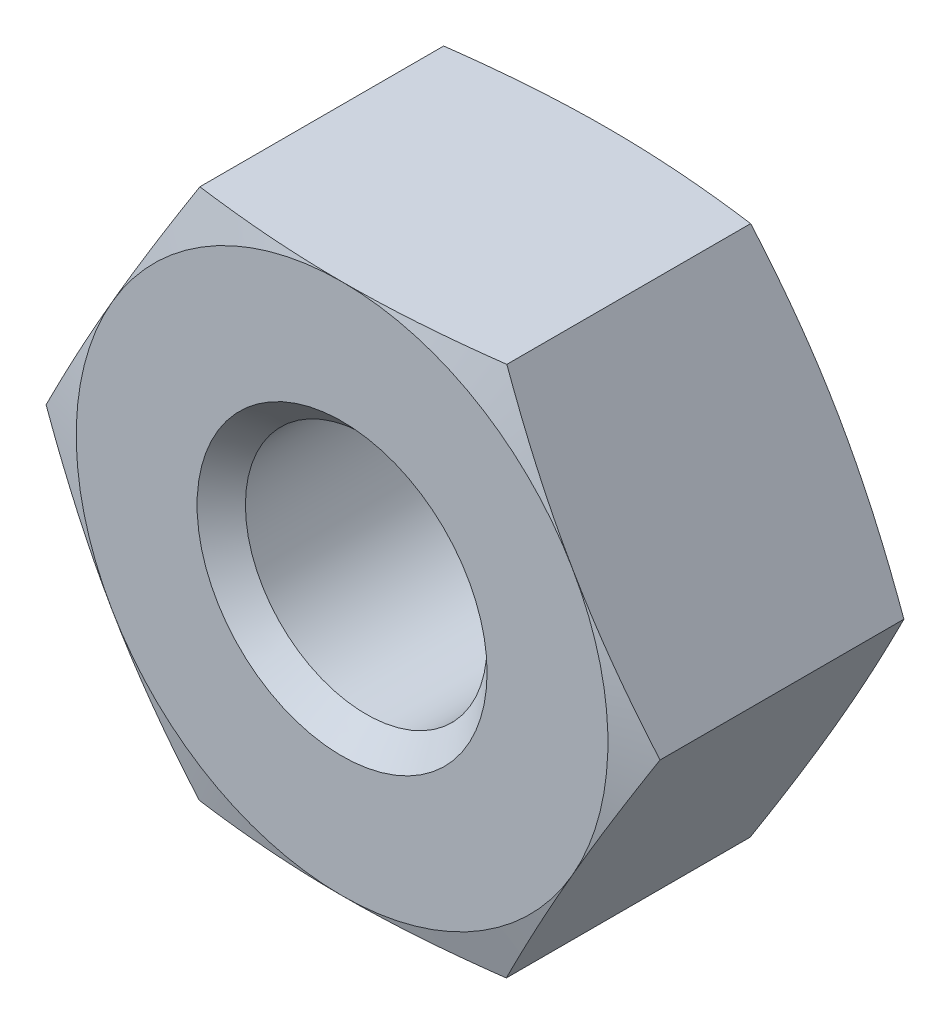
ISO-10303-21;
HEADER;
FILE_DESCRIPTION(('STEP AP214'),'2;1');
FILE_NAME('part.step','',(''),(''),'','','');
FILE_SCHEMA(('AUTOMOTIVE_DESIGN { 1 0 10303 214 1 1 1 1 }'));
ENDSEC;
DATA;
#1=APPLICATION_CONTEXT('core data for automotive mechanical design processes');
#2=APPLICATION_PROTOCOL_DEFINITION('international standard','automotive_design',2000,#1);
#3=PRODUCT_CONTEXT('',#1,'mechanical');
#4=PRODUCT('Part','Part','',(#3));
#5=PRODUCT_RELATED_PRODUCT_CATEGORY('part','',(#4));
#6=PRODUCT_DEFINITION_FORMATION('','',#4);
#7=PRODUCT_DEFINITION_CONTEXT('part definition',#1,'design');
#8=PRODUCT_DEFINITION('design','',#6,#7);
#9=PRODUCT_DEFINITION_SHAPE('','',#8);
#10=(LENGTH_UNIT() NAMED_UNIT(*) SI_UNIT(.MILLI.,.METRE.));
#11=(NAMED_UNIT(*) PLANE_ANGLE_UNIT() SI_UNIT($,.RADIAN.));
#12=(NAMED_UNIT(*) SI_UNIT($,.STERADIAN.) SOLID_ANGLE_UNIT());
#13=UNCERTAINTY_MEASURE_WITH_UNIT(LENGTH_MEASURE(1.E-05),#10,'distance_accuracy_value','');
#14=(GEOMETRIC_REPRESENTATION_CONTEXT(3) GLOBAL_UNCERTAINTY_ASSIGNED_CONTEXT((#13)) GLOBAL_UNIT_ASSIGNED_CONTEXT((#10,
#11,#12)) REPRESENTATION_CONTEXT('',''));
#15=CARTESIAN_POINT('',(0.,0.,0.));
#16=DIRECTION('',(0.,0.,1.));
#17=DIRECTION('',(1.,0.,0.));
#18=AXIS2_PLACEMENT_3D('',#15,#16,#17);
#19=CARTESIAN_POINT('',(6.35084977552726,-0.00636097623993477,5.50000000000001));
#20=DIRECTION('',(-0.866525766391595,-0.499132343351401,0.));
#21=DIRECTION('',(0.499132343351401,-0.866525766391595,0.));
#22=AXIS2_PLACEMENT_3D('',#19,#20,#21);
#23=PLANE('',#22);
#24=CARTESIAN_POINT('',(3.18081845166395,5.49701675310534,0.22801628688518));
#25=CARTESIAN_POINT('',(3.31246664803024,5.26846703924707,0.192664644462758));
#26=CARTESIAN_POINT('',(3.44435354163455,5.03950293167164,0.160571156165237));
#27=CARTESIAN_POINT('',(3.70859310915607,4.58076609201874,0.10418586946862));
#28=CARTESIAN_POINT('',(3.84094595027029,4.35099306967653,0.079897240134499));
#29=CARTESIAN_POINT('',(4.10531493618668,3.89203155138821,0.0405396576158701));
#30=CARTESIAN_POINT('',(4.23732929322934,3.66284615910729,0.0254237676799952));
#31=CARTESIAN_POINT('',(4.50152636358558,3.20418309725941,0.00515490271981662));
#32=CARTESIAN_POINT('',(4.63370903936968,2.97470549284606,0.));
#33=CARTESIAN_POINT('',(4.89807439093786,2.51575028401935,0.));
#34=CARTESIAN_POINT('',(5.03025706672196,2.28627267960599,0.00515490271981696));
#35=CARTESIAN_POINT('',(5.29445413707821,1.82760961775811,0.0254237676799957));
#36=CARTESIAN_POINT('',(5.42646849412087,1.59842422547719,0.0405396576158706));
#37=CARTESIAN_POINT('',(5.69083748003725,1.13946270718887,0.0798972401344997));
#38=CARTESIAN_POINT('',(5.82319032115147,0.909689684846668,0.104185869468621));
#39=CARTESIAN_POINT('',(6.08742988867299,0.450952845193763,0.160571156165238));
#40=CARTESIAN_POINT('',(6.21931678227731,0.221988737618332,0.192664644462759));
#41=CARTESIAN_POINT('',(6.35096497864359,-0.00656097623993358,0.22801628688518));
#42=B_SPLINE_CURVE_WITH_KNOTS('',3,(#24,#25,#26,#27,#28,#29,#30,#31,#32,#33,#34,#35,#36,#37,#38,
#39,#40,#41),.UNSPECIFIED.,.F.,.F.,(4,2,2,2,2,2,2,2,4),(0.,0.798379868632193,1.59708350096319,
2.39166493900168,3.18609259062311,3.98052024224453,4.77510168028303,5.57380531261402,
6.37218518124621),.UNSPECIFIED.);
#43=CARTESIAN_POINT('',(3.18093365478028,5.49681675310534,0.227985363800587));
#44=VERTEX_POINT('',#43);
#45=CARTESIAN_POINT('',(4.76589171515377,2.7452278884327,0.));
#46=VERTEX_POINT('',#45);
#47=EDGE_CURVE('E141',#44,#46,#42,.T.);
#48=ORIENTED_EDGE('',*,*,#47,.F.);
#49=DIRECTION('',(0.,0.,-1.));
#50=VECTOR('',#49,1.);
#51=CARTESIAN_POINT('',(3.18093365478028,5.49681675310534,5.50000000000001));
#52=LINE('',#51,#50);
#53=CARTESIAN_POINT('',(3.18093365478028,5.49681675310534,5.2720146361994));
#54=VERTEX_POINT('',#53);
#55=EDGE_CURVE('E356',#54,#44,#52,.T.);
#56=ORIENTED_EDGE('',*,*,#55,.F.);
#57=CARTESIAN_POINT('',(6.35096497864359,-0.00656097623993358,5.27198371311481));
#58=CARTESIAN_POINT('',(6.21931678227731,0.221988737618331,5.30733535553724));
#59=CARTESIAN_POINT('',(6.08742988867299,0.450952845193761,5.33942884383477));
#60=CARTESIAN_POINT('',(5.82319032115147,0.909689684846667,5.39581413053139));
#61=CARTESIAN_POINT('',(5.69083748003725,1.13946270718887,5.42010275986551));
#62=CARTESIAN_POINT('',(5.42646849412086,1.59842422547719,5.45946034238413));
#63=CARTESIAN_POINT('',(5.29445413707821,1.82760961775811,5.47457623232001));
#64=CARTESIAN_POINT('',(5.03025706672196,2.28627267960599,5.49484509728019));
#65=CARTESIAN_POINT('',(4.89807439093786,2.51575028401935,5.5));
#66=CARTESIAN_POINT('',(4.63370903936968,2.97470549284606,5.5));
#67=CARTESIAN_POINT('',(4.50152636358558,3.20418309725941,5.49484509728019));
#68=CARTESIAN_POINT('',(4.23732929322934,3.66284615910729,5.47457623232001));
#69=CARTESIAN_POINT('',(4.10531493618668,3.89203155138821,5.45946034238413));
#70=CARTESIAN_POINT('',(3.84094595027029,4.35099306967653,5.42010275986551));
#71=CARTESIAN_POINT('',(3.70859310915607,4.58076609201874,5.39581413053139));
#72=CARTESIAN_POINT('',(3.44435354163455,5.03950293167164,5.33942884383477));
#73=CARTESIAN_POINT('',(3.31246664803024,5.26846703924707,5.30733535553724));
#74=CARTESIAN_POINT('',(3.18081845166395,5.49701675310534,5.27198371311481));
#75=B_SPLINE_CURVE_WITH_KNOTS('',3,(#57,#58,#59,#60,#61,#62,#63,#64,#65,#66,#67,#68,#69,#70,#71,
#72,#73,#74),.UNSPECIFIED.,.F.,.F.,(4,2,2,2,2,2,2,2,4),(0.,0.798379868632195,1.59708350096319,
2.39166493900169,3.18609259062311,3.98052024224453,4.77510168028303,5.57380531261402,
6.37218518124622),.UNSPECIFIED.);
#76=CARTESIAN_POINT('',(4.76589171515377,2.7452278884327,5.50000000000001));
#77=VERTEX_POINT('',#76);
#78=EDGE_CURVE('E323',#77,#54,#75,.T.);
#79=ORIENTED_EDGE('',*,*,#78,.F.);
#80=CARTESIAN_POINT('',(6.35084977552726,-0.00636097623993304,5.2720146361994));
#81=VERTEX_POINT('',#80);
#82=EDGE_CURVE('E502',#81,#77,#75,.T.);
#83=ORIENTED_EDGE('',*,*,#82,.F.);
#84=DIRECTION('',(0.,0.,-1.));
#85=VECTOR('',#84,1.);
#86=CARTESIAN_POINT('',(6.35084977552726,-0.00636097623993477,5.50000000000001));
#87=LINE('',#86,#85);
#88=CARTESIAN_POINT('',(6.35084977552726,-0.00636097623993477,0.227985363800587));
#89=VERTEX_POINT('',#88);
#90=EDGE_CURVE('E175',#81,#89,#87,.T.);
#91=ORIENTED_EDGE('',*,*,#90,.T.);
#92=EDGE_CURVE('E154',#46,#89,#42,.T.);
#93=ORIENTED_EDGE('',*,*,#92,.F.);
#94=EDGE_LOOP('',(#48,#56,#79,#83,#91,#93));
#95=FACE_BOUND('',#94,.T.);
#96=ADVANCED_FACE('F52',(#95),#23,.F.);
#97=CARTESIAN_POINT('',(3.18093365478028,5.49681675310534,5.50000000000001));
#98=DIRECTION('',(-0.00100159400302746,-0.999999498404602,0.));
#99=DIRECTION('',(0.999999498404602,-0.00100159400302746,0.));
#100=AXIS2_PLACEMENT_3D('',#97,#98,#99);
#101=PLANE('',#100);
#102=CARTESIAN_POINT('',(-3.17011612074698,5.50317792966417,0.228012159366131));
#103=CARTESIAN_POINT('',(-2.9063647120604,5.50291375770243,0.192661114730014));
#104=CARTESIAN_POINT('',(-2.64213508884684,5.50264910676365,0.160568187694157));
#105=CARTESIAN_POINT('',(-2.11274268631971,5.50211887024207,0.10418390955789));
#106=CARTESIAN_POINT('',(-1.84757957204988,5.50185328432378,0.0798957273696159));
#107=CARTESIAN_POINT('',(-1.31792788831693,5.50132278810756,0.0405388790591946));
#108=CARTESIAN_POINT('',(-1.05344290043137,5.50105788139693,0.0254232777808005));
#109=CARTESIAN_POINT('',(-0.524135635901857,5.5005277301491,0.00515480204786059));
#110=CARTESIAN_POINT('',(-0.259313434442604,5.5002624856872,0.));
#111=CARTESIAN_POINT('',(0.270330968475903,5.49973199676341,0.));
#112=CARTESIAN_POINT('',(0.535153169935157,5.49946675230151,0.00515480204786038));
#113=CARTESIAN_POINT('',(1.06446043446467,5.49893660105368,0.0254232777808003));
#114=CARTESIAN_POINT('',(1.32894542235023,5.49867169434305,0.0405388790591946));
#115=CARTESIAN_POINT('',(1.85859710608318,5.49814119812683,0.079895727369616));
#116=CARTESIAN_POINT('',(2.12376022035301,5.49787561220854,0.10418390955789));
#117=CARTESIAN_POINT('',(2.65315262288014,5.49734537568695,0.160568187694156));
#118=CARTESIAN_POINT('',(2.9173822460937,5.49708072474817,0.192661114730013));
#119=CARTESIAN_POINT('',(3.18113365478028,5.49681655278644,0.228012159366131));
#120=B_SPLINE_CURVE_WITH_KNOTS('',3,(#102,#103,#104,#105,#106,#107,#108,#109,#110,#111,#112,
#113,#114,#115,#116,#117,#118,#119),.UNSPECIFIED.,.F.,.F.,(4,2,2,2,2,2,2,2,4),(0.,
0.798372052941037,1.59706785554565,2.39164157380206,3.18606151238685,3.98048145097164,
4.77505516922805,5.57375097183266,6.3721230247737),.UNSPECIFIED.);
#121=CARTESIAN_POINT('',(-3.16991612074698,5.50317772934527,0.227985363800587));
#122=VERTEX_POINT('',#121);
#123=CARTESIAN_POINT('',(0.00550876701665114,5.4999972412253,0.));
#124=VERTEX_POINT('',#123);
#125=EDGE_CURVE('E67',#122,#124,#120,.T.);
#126=ORIENTED_EDGE('',*,*,#125,.F.);
#127=DIRECTION('',(0.,0.,-1.));
#128=VECTOR('',#127,1.);
#129=CARTESIAN_POINT('',(-3.16991612074698,5.50317772934527,5.50000000000001));
#130=LINE('',#129,#128);
#131=CARTESIAN_POINT('',(-3.16991612074698,5.50317772934527,5.2720146361994));
#132=VERTEX_POINT('',#131);
#133=EDGE_CURVE('E319',#132,#122,#130,.T.);
#134=ORIENTED_EDGE('',*,*,#133,.F.);
#135=CARTESIAN_POINT('',(3.18113365478028,5.49681655278644,5.27198784063387));
#136=CARTESIAN_POINT('',(2.9173822460937,5.49708072474817,5.30733888526999));
#137=CARTESIAN_POINT('',(2.65315262288014,5.49734537568695,5.33943181230585));
#138=CARTESIAN_POINT('',(2.12376022035301,5.49787561220854,5.39581609044212));
#139=CARTESIAN_POINT('',(1.85859710608318,5.49814119812683,5.42010427263039));
#140=CARTESIAN_POINT('',(1.32894542235023,5.49867169434305,5.45946112094081));
#141=CARTESIAN_POINT('',(1.06446043446467,5.49893660105368,5.4745767222192));
#142=CARTESIAN_POINT('',(0.535153169935157,5.49946675230151,5.49484519795214));
#143=CARTESIAN_POINT('',(0.270330968475903,5.49973199676341,5.50000000000001));
#144=CARTESIAN_POINT('',(-0.259313434442604,5.5002624856872,5.50000000000001));
#145=CARTESIAN_POINT('',(-0.524135635901858,5.5005277301491,5.49484519795214));
#146=CARTESIAN_POINT('',(-1.05344290043137,5.50105788139693,5.4745767222192));
#147=CARTESIAN_POINT('',(-1.31792788831693,5.50132278810756,5.45946112094081));
#148=CARTESIAN_POINT('',(-1.84757957204988,5.50185328432378,5.42010427263039));
#149=CARTESIAN_POINT('',(-2.11274268631971,5.50211887024207,5.39581609044212));
#150=CARTESIAN_POINT('',(-2.64213508884684,5.50264910676365,5.33943181230585));
#151=CARTESIAN_POINT('',(-2.9063647120604,5.50291375770243,5.30733888526999));
#152=CARTESIAN_POINT('',(-3.17011612074698,5.50317792966417,5.27198784063387));
#153=B_SPLINE_CURVE_WITH_KNOTS('',3,(#135,#136,#137,#138,#139,#140,#141,#142,#143,#144,#145,
#146,#147,#148,#149,#150,#151,#152),.UNSPECIFIED.,.F.,.F.,(4,2,2,2,2,2,2,2,4),(0.,
0.798372052941037,1.59706785554565,2.39164157380206,3.18606151238685,3.98048145097165,
4.77505516922806,5.57375097183266,6.3721230247737),.UNSPECIFIED.);
#154=CARTESIAN_POINT('',(0.00550876701665114,5.4999972412253,5.50000000000001));
#155=VERTEX_POINT('',#154);
#156=EDGE_CURVE('E285',#155,#132,#153,.T.);
#157=ORIENTED_EDGE('',*,*,#156,.F.);
#158=EDGE_CURVE('E317',#54,#155,#153,.T.);
#159=ORIENTED_EDGE('',*,*,#158,.F.);
#160=ORIENTED_EDGE('',*,*,#55,.T.);
#161=EDGE_CURVE('E148',#124,#44,#120,.T.);
#162=ORIENTED_EDGE('',*,*,#161,.F.);
#163=EDGE_LOOP('',(#126,#134,#157,#159,#160,#162));
#164=FACE_BOUND('',#163,.T.);
#165=ADVANCED_FACE('F278',(#164),#101,.F.);
#166=CARTESIAN_POINT('',(-3.16991612074698,5.50317772934527,5.50000000000001));
#167=DIRECTION('',(0.865524172388568,-0.5008671550532,0.));
#168=DIRECTION('',(0.5008671550532,0.865524172388568,0.));
#169=AXIS2_PLACEMENT_3D('',#166,#167,#168);
#170=PLANE('',#169);
#171=CARTESIAN_POINT('',(-6.35096551282751,0.00616097623992902,0.228016322670693));
#172=CARTESIAN_POINT('',(-6.21885974171825,0.234446534702935,0.192664675065478));
#173=CARTESIAN_POINT('',(-6.08651444370017,0.463146007968348,0.160571181901831));
#174=CARTESIAN_POINT('',(-5.82135644835788,0.921352644509466,0.104185886461016));
#175=CARTESIAN_POINT('',(-5.68854358325546,1.15086009771454,0.0798972532501498));
#176=CARTESIAN_POINT('',(-5.42325571968121,1.60929115323153,0.0405396643659477));
#177=CARTESIAN_POINT('',(-5.2907825151832,1.83821165546455,0.0254237719274159));
#178=CARTESIAN_POINT('',(-5.0256671647292,2.29634459944813,0.00515490359264132));
#179=CARTESIAN_POINT('',(-4.89302505643316,2.52555697612036,0.));
#180=CARTESIAN_POINT('',(-4.62774083984108,2.98398172946484,0.));
#181=CARTESIAN_POINT('',(-4.49509873154504,3.21319410613707,0.00515490359264136));
#182=CARTESIAN_POINT('',(-4.22998338109104,3.67132705012066,0.0254237719274159));
#183=CARTESIAN_POINT('',(-4.09751017659303,3.90024755235367,0.0405396643659477));
#184=CARTESIAN_POINT('',(-3.83222231301878,4.35867860787067,0.0798972532501499));
#185=CARTESIAN_POINT('',(-3.69940944791636,4.58818606107574,0.104185886461017));
#186=CARTESIAN_POINT('',(-3.43425145257407,5.04639269761685,0.160571181901831));
#187=CARTESIAN_POINT('',(-3.30190615455599,5.27509217088227,0.192664675065479));
#188=CARTESIAN_POINT('',(-3.16980038344673,5.50337772934527,0.228016322670693));
#189=B_SPLINE_CURVE_WITH_KNOTS('',3,(#171,#172,#173,#174,#175,#176,#177,#178,#179,#180,#181,
#182,#183,#184,#185,#186,#187,#188),.UNSPECIFIED.,.F.,.F.,(4,2,2,2,2,2,2,2,4),(0.,
0.798379936393838,1.59708363660816,2.39166514157677,3.18609286006982,3.98052057856287,
4.77510208353147,5.5738057837458,6.37218572013964),.UNSPECIFIED.);
#190=CARTESIAN_POINT('',(-6.35084977552726,0.00636097623992957,0.227985363800587));
#191=VERTEX_POINT('',#190);
#192=CARTESIAN_POINT('',(-4.76038294813712,2.7547693527926,0.));
#193=VERTEX_POINT('',#192);
#194=EDGE_CURVE('E75',#191,#193,#189,.T.);
#195=ORIENTED_EDGE('',*,*,#194,.F.);
#196=DIRECTION('',(0.,0.,-1.));
#197=VECTOR('',#196,1.);
#198=CARTESIAN_POINT('',(-6.35084977552726,0.00636097623992957,5.50000000000001));
#199=LINE('',#198,#197);
#200=CARTESIAN_POINT('',(-6.35084977552726,0.00636097623992957,5.2720146361994));
#201=VERTEX_POINT('',#200);
#202=EDGE_CURVE('E347',#201,#191,#199,.T.);
#203=ORIENTED_EDGE('',*,*,#202,.F.);
#204=CARTESIAN_POINT('',(-3.16980038344673,5.50337772934527,5.27198367732931));
#205=CARTESIAN_POINT('',(-3.30190615455599,5.27509217088227,5.30733532493453));
#206=CARTESIAN_POINT('',(-3.43425145257407,5.04639269761685,5.33942881809817));
#207=CARTESIAN_POINT('',(-3.69940944791636,4.58818606107574,5.39581411353899));
#208=CARTESIAN_POINT('',(-3.83222231301878,4.35867860787067,5.42010274674985));
#209=CARTESIAN_POINT('',(-4.09751017659303,3.90024755235367,5.45946033563406));
#210=CARTESIAN_POINT('',(-4.22998338109104,3.67132705012065,5.47457622807259));
#211=CARTESIAN_POINT('',(-4.49509873154504,3.21319410613707,5.49484509640736));
#212=CARTESIAN_POINT('',(-4.62774083984108,2.98398172946484,5.5));
#213=CARTESIAN_POINT('',(-4.89302505643316,2.52555697612036,5.5));
#214=CARTESIAN_POINT('',(-5.0256671647292,2.29634459944813,5.49484509640736));
#215=CARTESIAN_POINT('',(-5.2907825151832,1.83821165546455,5.47457622807259));
#216=CARTESIAN_POINT('',(-5.42325571968121,1.60929115323153,5.45946033563406));
#217=CARTESIAN_POINT('',(-5.68854358325546,1.15086009771454,5.42010274674985));
#218=CARTESIAN_POINT('',(-5.82135644835788,0.921352644509466,5.39581411353899));
#219=CARTESIAN_POINT('',(-6.08651444370017,0.463146007968348,5.33942881809817));
#220=CARTESIAN_POINT('',(-6.21885974171824,0.234446534702936,5.30733532493453));
#221=CARTESIAN_POINT('',(-6.35096551282751,0.00616097623992902,5.27198367732931));
#222=B_SPLINE_CURVE_WITH_KNOTS('',3,(#204,#205,#206,#207,#208,#209,#210,#211,#212,#213,#214,
#215,#216,#217,#218,#219,#220,#221),.UNSPECIFIED.,.F.,.F.,(4,2,2,2,2,2,2,2,4),(0.,
0.798379936393837,1.59708363660816,2.39166514157677,3.18609286006982,3.98052057856287,
4.77510208353147,5.5738057837458,6.37218572013964),.UNSPECIFIED.);
#223=CARTESIAN_POINT('',(-4.76038294813712,2.7547693527926,5.50000000000001));
#224=VERTEX_POINT('',#223);
#225=EDGE_CURVE('E264',#224,#201,#222,.T.);
#226=ORIENTED_EDGE('',*,*,#225,.F.);
#227=EDGE_CURVE('E322',#132,#224,#222,.T.);
#228=ORIENTED_EDGE('',*,*,#227,.F.);
#229=ORIENTED_EDGE('',*,*,#133,.T.);
#230=EDGE_CURVE('E215',#193,#122,#189,.T.);
#231=ORIENTED_EDGE('',*,*,#230,.F.);
#232=EDGE_LOOP('',(#195,#203,#226,#228,#229,#231));
#233=FACE_BOUND('',#232,.T.);
#234=ADVANCED_FACE('F273',(#233),#170,.F.);
#235=CARTESIAN_POINT('',(-6.35084977552726,0.00636097623992957,5.50000000000001));
#236=DIRECTION('',(0.866525766391595,0.499132343351401,0.));
#237=DIRECTION('',(-0.499132343351401,0.866525766391595,0.));
#238=AXIS2_PLACEMENT_3D('',#235,#236,#237);
#239=PLANE('',#238);
#240=CARTESIAN_POINT('',(-3.18081845166395,-5.49701675310534,0.22801628688518));
#241=CARTESIAN_POINT('',(-3.31246664803023,-5.26846703924708,0.192664644462759));
#242=CARTESIAN_POINT('',(-3.44435354163455,-5.03950293167165,0.160571156165237));
#243=CARTESIAN_POINT('',(-3.70859310915607,-4.58076609201874,0.10418586946862));
#244=CARTESIAN_POINT('',(-3.84094595027029,-4.35099306967653,0.0798972401344997));
#245=CARTESIAN_POINT('',(-4.10531493618667,-3.89203155138821,0.0405396576158706));
#246=CARTESIAN_POINT('',(-4.23732929322933,-3.6628461591073,0.0254237676799956));
#247=CARTESIAN_POINT('',(-4.50152636358558,-3.20418309725942,0.00515490271981682));
#248=CARTESIAN_POINT('',(-4.63370903936968,-2.97470549284606,0.));
#249=CARTESIAN_POINT('',(-4.89807439093786,-2.51575028401935,0.));
#250=CARTESIAN_POINT('',(-5.03025706672196,-2.286272679606,0.00515490271981717));
#251=CARTESIAN_POINT('',(-5.2944541370782,-1.82760961775812,0.0254237676799957));
#252=CARTESIAN_POINT('',(-5.42646849412086,-1.5984242254772,0.0405396576158704));
#253=CARTESIAN_POINT('',(-5.69083748003725,-1.13946270718888,0.0798972401344995));
#254=CARTESIAN_POINT('',(-5.82319032115147,-0.909689684846672,0.10418586946862));
#255=CARTESIAN_POINT('',(-6.08742988867299,-0.450952845193765,0.160571156165238));
#256=CARTESIAN_POINT('',(-6.21931678227731,-0.221988737618334,0.192664644462759));
#257=CARTESIAN_POINT('',(-6.35096497864359,0.00656097623993185,0.22801628688518));
#258=B_SPLINE_CURVE_WITH_KNOTS('',3,(#240,#241,#242,#243,#244,#245,#246,#247,#248,#249,#250,
#251,#252,#253,#254,#255,#256,#257),.UNSPECIFIED.,.F.,.F.,(4,2,2,2,2,2,2,2,4),(0.,
0.798379868632194,1.59708350096319,2.39166493900169,3.18609259062311,3.98052024224453,
4.77510168028303,5.57380531261402,6.37218518124622),.UNSPECIFIED.);
#259=CARTESIAN_POINT('',(-3.18093365478028,-5.49681675310534,0.227985363800587));
#260=VERTEX_POINT('',#259);
#261=CARTESIAN_POINT('',(-4.76589171515377,-2.74522788843271,0.));
#262=VERTEX_POINT('',#261);
#263=EDGE_CURVE('E190',#260,#262,#258,.T.);
#264=ORIENTED_EDGE('',*,*,#263,.F.);
#265=DIRECTION('',(0.,0.,-1.));
#266=VECTOR('',#265,1.);
#267=CARTESIAN_POINT('',(-3.18093365478028,-5.49681675310534,5.50000000000001));
#268=LINE('',#267,#266);
#269=CARTESIAN_POINT('',(-3.18093365478028,-5.49681675310534,5.2720146361994));
#270=VERTEX_POINT('',#269);
#271=EDGE_CURVE('E344',#270,#260,#268,.T.);
#272=ORIENTED_EDGE('',*,*,#271,.F.);
#273=CARTESIAN_POINT('',(-6.35096497864359,0.00656097623992838,5.27198371311481));
#274=CARTESIAN_POINT('',(-6.2193167822773,-0.221988737618337,5.30733535553724));
#275=CARTESIAN_POINT('',(-6.08742988867299,-0.450952845193768,5.33942884383477));
#276=CARTESIAN_POINT('',(-5.82319032115147,-0.909689684846674,5.39581413053139));
#277=CARTESIAN_POINT('',(-5.69083748003725,-1.13946270718888,5.42010275986551));
#278=CARTESIAN_POINT('',(-5.42646849412086,-1.5984242254772,5.45946034238413));
#279=CARTESIAN_POINT('',(-5.2944541370782,-1.82760961775812,5.47457623232001));
#280=CARTESIAN_POINT('',(-5.03025706672196,-2.286272679606,5.49484509728019));
#281=CARTESIAN_POINT('',(-4.89807439093786,-2.51575028401935,5.5));
#282=CARTESIAN_POINT('',(-4.63370903936967,-2.97470549284606,5.5));
#283=CARTESIAN_POINT('',(-4.50152636358558,-3.20418309725942,5.49484509728019));
#284=CARTESIAN_POINT('',(-4.23732929322933,-3.6628461591073,5.47457623232001));
#285=CARTESIAN_POINT('',(-4.10531493618667,-3.89203155138822,5.45946034238413));
#286=CARTESIAN_POINT('',(-3.84094595027029,-4.35099306967654,5.42010275986551));
#287=CARTESIAN_POINT('',(-3.70859310915607,-4.58076609201874,5.39581413053139));
#288=CARTESIAN_POINT('',(-3.44435354163455,-5.03950293167165,5.33942884383477));
#289=CARTESIAN_POINT('',(-3.31246664803023,-5.26846703924708,5.30733535553724));
#290=CARTESIAN_POINT('',(-3.18081845166394,-5.49701675310535,5.27198371311481));
#291=B_SPLINE_CURVE_WITH_KNOTS('',3,(#273,#274,#275,#276,#277,#278,#279,#280,#281,#282,#283,
#284,#285,#286,#287,#288,#289,#290),.UNSPECIFIED.,.F.,.F.,(4,2,2,2,2,2,2,2,4),(0.,
0.798379868632196,1.59708350096319,2.39166493900169,3.18609259062311,3.98052024224453,
4.77510168028303,5.57380531261402,6.37218518124622),.UNSPECIFIED.);
#292=CARTESIAN_POINT('',(-4.76589171515377,-2.74522788843271,5.50000000000001));
#293=VERTEX_POINT('',#292);
#294=EDGE_CURVE('E257',#293,#270,#291,.T.);
#295=ORIENTED_EDGE('',*,*,#294,.F.);
#296=EDGE_CURVE('E263',#201,#293,#291,.T.);
#297=ORIENTED_EDGE('',*,*,#296,.F.);
#298=ORIENTED_EDGE('',*,*,#202,.T.);
#299=EDGE_CURVE('E295',#262,#191,#258,.T.);
#300=ORIENTED_EDGE('',*,*,#299,.F.);
#301=EDGE_LOOP('',(#264,#272,#295,#297,#298,#300));
#302=FACE_BOUND('',#301,.T.);
#303=ADVANCED_FACE('F270',(#302),#239,.F.);
#304=CARTESIAN_POINT('',(-3.18093365478028,-5.49681675310534,5.50000000000001));
#305=DIRECTION('',(0.00100159400302724,0.999999498404602,0.));
#306=DIRECTION('',(-0.999999498404602,0.00100159400302724,0.));
#307=AXIS2_PLACEMENT_3D('',#304,#305,#306);
#308=PLANE('',#307);
#309=CARTESIAN_POINT('',(3.17011612074698,-5.50317792966418,0.228012159366131));
#310=CARTESIAN_POINT('',(2.9063647120604,-5.50291375770244,0.192661114730014));
#311=CARTESIAN_POINT('',(2.64213508884684,-5.50264910676365,0.160568187694157));
#312=CARTESIAN_POINT('',(2.11274268631971,-5.50211887024207,0.104183909557891));
#313=CARTESIAN_POINT('',(1.84757957204988,-5.50185328432378,0.0798957273696164));
#314=CARTESIAN_POINT('',(1.31792788831693,-5.50132278810756,0.040538879059195));
#315=CARTESIAN_POINT('',(1.05344290043137,-5.50105788139693,0.0254232777808009));
#316=CARTESIAN_POINT('',(0.524135635901857,-5.5005277301491,0.00515480204786108));
#317=CARTESIAN_POINT('',(0.259313434442604,-5.5002624856872,0.));
#318=CARTESIAN_POINT('',(-0.270330968475902,-5.49973199676341,0.));
#319=CARTESIAN_POINT('',(-0.535153169935155,-5.49946675230152,0.00515480204786099));
#320=CARTESIAN_POINT('',(-1.06446043446467,-5.49893660105368,0.0254232777808009));
#321=CARTESIAN_POINT('',(-1.32894542235022,-5.49867169434305,0.040538879059195));
#322=CARTESIAN_POINT('',(-1.85859710608318,-5.49814119812683,0.0798957273696163));
#323=CARTESIAN_POINT('',(-2.12376022035301,-5.49787561220854,0.10418390955789));
#324=CARTESIAN_POINT('',(-2.65315262288014,-5.49734537568696,0.160568187694157));
#325=CARTESIAN_POINT('',(-2.9173822460937,-5.49708072474818,0.192661114730014));
#326=CARTESIAN_POINT('',(-3.18113365478028,-5.49681655278644,0.228012159366131));
#327=B_SPLINE_CURVE_WITH_KNOTS('',3,(#309,#310,#311,#312,#313,#314,#315,#316,#317,#318,#319,
#320,#321,#322,#323,#324,#325,#326),.UNSPECIFIED.,.F.,.F.,(4,2,2,2,2,2,2,2,4),(0.,
0.798372052941036,1.59706785554565,2.39164157380206,3.18606151238685,3.98048145097164,
4.77505516922805,5.57375097183266,6.3721230247737),.UNSPECIFIED.);
#328=CARTESIAN_POINT('',(3.16991612074698,-5.50317772934528,0.227985363800587));
#329=VERTEX_POINT('',#328);
#330=CARTESIAN_POINT('',(-0.00550876701665114,-5.49999724122531,0.));
#331=VERTEX_POINT('',#330);
#332=EDGE_CURVE('E176',#329,#331,#327,.T.);
#333=ORIENTED_EDGE('',*,*,#332,.F.);
#334=DIRECTION('',(0.,0.,-1.));
#335=VECTOR('',#334,1.);
#336=CARTESIAN_POINT('',(3.16991612074698,-5.50317772934528,5.50000000000001));
#337=LINE('',#336,#335);
#338=CARTESIAN_POINT('',(3.16991612074698,-5.50317772934528,5.2720146361994));
#339=VERTEX_POINT('',#338);
#340=EDGE_CURVE('E348',#339,#329,#337,.T.);
#341=ORIENTED_EDGE('',*,*,#340,.F.);
#342=CARTESIAN_POINT('',(-3.18113365478028,-5.49681655278644,5.27198784063387));
#343=CARTESIAN_POINT('',(-2.9173822460937,-5.49708072474818,5.30733888526999));
#344=CARTESIAN_POINT('',(-2.65315262288014,-5.49734537568696,5.33943181230585));
#345=CARTESIAN_POINT('',(-2.12376022035301,-5.49787561220854,5.39581609044211));
#346=CARTESIAN_POINT('',(-1.85859710608317,-5.49814119812683,5.42010427263039));
#347=CARTESIAN_POINT('',(-1.32894542235022,-5.49867169434305,5.45946112094081));
#348=CARTESIAN_POINT('',(-1.06446043446467,-5.49893660105368,5.4745767222192));
#349=CARTESIAN_POINT('',(-0.535153169935155,-5.49946675230152,5.49484519795214));
#350=CARTESIAN_POINT('',(-0.270330968475902,-5.49973199676341,5.5));
#351=CARTESIAN_POINT('',(0.259313434442604,-5.5002624856872,5.5));
#352=CARTESIAN_POINT('',(0.524135635901857,-5.5005277301491,5.49484519795214));
#353=CARTESIAN_POINT('',(1.05344290043137,-5.50105788139693,5.4745767222192));
#354=CARTESIAN_POINT('',(1.31792788831693,-5.50132278810756,5.45946112094081));
#355=CARTESIAN_POINT('',(1.84757957204988,-5.50185328432378,5.42010427263039));
#356=CARTESIAN_POINT('',(2.11274268631971,-5.50211887024207,5.39581609044211));
#357=CARTESIAN_POINT('',(2.64213508884684,-5.50264910676365,5.33943181230585));
#358=CARTESIAN_POINT('',(2.9063647120604,-5.50291375770244,5.30733888526999));
#359=CARTESIAN_POINT('',(3.17011612074698,-5.50317792966418,5.27198784063387));
#360=B_SPLINE_CURVE_WITH_KNOTS('',3,(#342,#343,#344,#345,#346,#347,#348,#349,#350,#351,#352,
#353,#354,#355,#356,#357,#358,#359),.UNSPECIFIED.,.F.,.F.,(4,2,2,2,2,2,2,2,4),(0.,
0.798372052941036,1.59706785554564,2.39164157380205,3.18606151238685,3.98048145097164,
4.77505516922805,5.57375097183266,6.3721230247737),.UNSPECIFIED.);
#361=CARTESIAN_POINT('',(-0.00550876701665114,-5.49999724122531,5.50000000000001));
#362=VERTEX_POINT('',#361);
#363=EDGE_CURVE('E250',#362,#339,#360,.T.);
#364=ORIENTED_EDGE('',*,*,#363,.F.);
#365=EDGE_CURVE('E256',#270,#362,#360,.T.);
#366=ORIENTED_EDGE('',*,*,#365,.F.);
#367=ORIENTED_EDGE('',*,*,#271,.T.);
#368=EDGE_CURVE('E153',#331,#260,#327,.T.);
#369=ORIENTED_EDGE('',*,*,#368,.F.);
#370=EDGE_LOOP('',(#333,#341,#364,#366,#367,#369));
#371=FACE_BOUND('',#370,.T.);
#372=ADVANCED_FACE('F237',(#371),#308,.F.);
#373=CARTESIAN_POINT('',(3.16991612074698,-5.50317772934528,5.50000000000001));
#374=DIRECTION('',(-0.865524172388568,0.500867155053201,0.));
#375=DIRECTION('',(-0.5008671550532,-0.865524172388567,0.));
#376=AXIS2_PLACEMENT_3D('',#373,#374,#375);
#377=PLANE('',#376);
#378=CARTESIAN_POINT('',(6.35096551282751,-0.00616097623993422,0.228016322670693));
#379=CARTESIAN_POINT('',(6.21885974171825,-0.234446534702941,0.192664675065479));
#380=CARTESIAN_POINT('',(6.08651444370017,-0.463146007968353,0.160571181901832));
#381=CARTESIAN_POINT('',(5.82135644835788,-0.921352644509471,0.104185886461017));
#382=CARTESIAN_POINT('',(5.68854358325546,-1.15086009771454,0.0798972532501507));
#383=CARTESIAN_POINT('',(5.42325571968121,-1.60929115323154,0.0405396643659488));
#384=CARTESIAN_POINT('',(5.2907825151832,-1.83821165546455,0.0254237719274171));
#385=CARTESIAN_POINT('',(5.0256671647292,-2.29634459944814,0.00515490359264265));
#386=CARTESIAN_POINT('',(4.89302505643316,-2.52555697612037,0.));
#387=CARTESIAN_POINT('',(4.62774083984108,-2.98398172946484,0.));
#388=CARTESIAN_POINT('',(4.49509873154504,-3.21319410613708,0.00515490359264269));
#389=CARTESIAN_POINT('',(4.22998338109104,-3.67132705012066,0.0254237719274173));
#390=CARTESIAN_POINT('',(4.09751017659303,-3.90024755235367,0.0405396643659491));
#391=CARTESIAN_POINT('',(3.83222231301878,-4.35867860787067,0.0798972532501513));
#392=CARTESIAN_POINT('',(3.69940944791636,-4.58818606107574,0.104185886461018));
#393=CARTESIAN_POINT('',(3.43425145257407,-5.04639269761686,0.160571181901832));
#394=CARTESIAN_POINT('',(3.301906154556,-5.27509217088227,0.192664675065479));
#395=CARTESIAN_POINT('',(3.16980038344673,-5.50337772934528,0.228016322670693));
#396=B_SPLINE_CURVE_WITH_KNOTS('',3,(#378,#379,#380,#381,#382,#383,#384,#385,#386,#387,#388,
#389,#390,#391,#392,#393,#394,#395),.UNSPECIFIED.,.F.,.F.,(4,2,2,2,2,2,2,2,4),(0.,
0.798379936393837,1.59708363660816,2.39166514157677,3.18609286006982,3.98052057856287,
4.77510208353147,5.5738057837458,6.37218572013964),.UNSPECIFIED.);
#397=CARTESIAN_POINT('',(4.76038294813712,-2.7547693527926,0.));
#398=VERTEX_POINT('',#397);
#399=EDGE_CURVE('E161',#89,#398,#396,.T.);
#400=ORIENTED_EDGE('',*,*,#399,.F.);
#401=ORIENTED_EDGE('',*,*,#90,.F.);
#402=CARTESIAN_POINT('',(3.16980038344673,-5.50337772934528,5.27198367732931));
#403=CARTESIAN_POINT('',(3.301906154556,-5.27509217088227,5.30733532493453));
#404=CARTESIAN_POINT('',(3.43425145257407,-5.04639269761686,5.33942881809817));
#405=CARTESIAN_POINT('',(3.69940944791636,-4.58818606107574,5.39581411353899));
#406=CARTESIAN_POINT('',(3.83222231301878,-4.35867860787067,5.42010274674985));
#407=CARTESIAN_POINT('',(4.09751017659303,-3.90024755235367,5.45946033563406));
#408=CARTESIAN_POINT('',(4.22998338109104,-3.67132705012066,5.47457622807259));
#409=CARTESIAN_POINT('',(4.49509873154504,-3.21319410613708,5.49484509640736));
#410=CARTESIAN_POINT('',(4.62774083984108,-2.98398172946484,5.5));
#411=CARTESIAN_POINT('',(4.89302505643316,-2.52555697612037,5.5));
#412=CARTESIAN_POINT('',(5.0256671647292,-2.29634459944814,5.49484509640736));
#413=CARTESIAN_POINT('',(5.2907825151832,-1.83821165546455,5.47457622807259));
#414=CARTESIAN_POINT('',(5.42325571968121,-1.60929115323154,5.45946033563406));
#415=CARTESIAN_POINT('',(5.68854358325546,-1.15086009771454,5.42010274674985));
#416=CARTESIAN_POINT('',(5.82135644835788,-0.921352644509472,5.39581411353899));
#417=CARTESIAN_POINT('',(6.08651444370017,-0.463146007968354,5.33942881809817));
#418=CARTESIAN_POINT('',(6.21885974171825,-0.234446534702941,5.30733532493453));
#419=CARTESIAN_POINT('',(6.35096551282751,-0.00616097623993422,5.27198367732931));
#420=B_SPLINE_CURVE_WITH_KNOTS('',3,(#402,#403,#404,#405,#406,#407,#408,#409,#410,#411,#412,
#413,#414,#415,#416,#417,#418,#419),.UNSPECIFIED.,.F.,.F.,(4,2,2,2,2,2,2,2,4),(0.,
0.798379936393837,1.59708363660816,2.39166514157677,3.18609286006982,3.98052057856287,
4.77510208353147,5.5738057837458,6.37218572013964),.UNSPECIFIED.);
#421=CARTESIAN_POINT('',(4.76038294813712,-2.7547693527926,5.50000000000001));
#422=VERTEX_POINT('',#421);
#423=EDGE_CURVE('E242',#422,#81,#420,.T.);
#424=ORIENTED_EDGE('',*,*,#423,.F.);
#425=EDGE_CURVE('E248',#339,#422,#420,.T.);
#426=ORIENTED_EDGE('',*,*,#425,.F.);
#427=ORIENTED_EDGE('',*,*,#340,.T.);
#428=EDGE_CURVE('E224',#398,#329,#396,.T.);
#429=ORIENTED_EDGE('',*,*,#428,.F.);
#430=EDGE_LOOP('',(#400,#401,#424,#426,#427,#429));
#431=FACE_BOUND('',#430,.T.);
#432=ADVANCED_FACE('F233',(#431),#377,.F.);
#433=CARTESIAN_POINT('',(0.,0.,5.50000000000001));
#434=DIRECTION('',(0.,0.,-1.));
#435=DIRECTION('',(1.,0.,0.));
#436=AXIS2_PLACEMENT_3D('',#433,#434,#435);
#437=CONICAL_SURFACE('',#436,5.5,1.30899693899575);
#438=ORIENTED_EDGE('',*,*,#82,.T.);
#439=CARTESIAN_POINT('',(0.,0.,5.50000000000001));
#440=DIRECTION('',(0.,0.,1.));
#441=DIRECTION('',(1.,0.,0.));
#442=AXIS2_PLACEMENT_3D('',#439,#440,#441);
#443=CIRCLE('',#442,5.5);
#444=EDGE_CURVE('E311',#422,#77,#443,.T.);
#445=ORIENTED_EDGE('',*,*,#444,.F.);
#446=ORIENTED_EDGE('',*,*,#423,.T.);
#447=EDGE_LOOP('',(#438,#445,#446));
#448=FACE_BOUND('',#447,.T.);
#449=ADVANCED_FACE('F209',(#448),#437,.T.);
#450=ORIENTED_EDGE('',*,*,#363,.T.);
#451=ORIENTED_EDGE('',*,*,#425,.T.);
#452=EDGE_CURVE('E340',#362,#422,#443,.T.);
#453=ORIENTED_EDGE('',*,*,#452,.F.);
#454=EDGE_LOOP('',(#450,#451,#453));
#455=FACE_BOUND('',#454,.T.);
#456=ADVANCED_FACE('F401',(#455),#437,.T.);
#457=ORIENTED_EDGE('',*,*,#294,.T.);
#458=ORIENTED_EDGE('',*,*,#365,.T.);
#459=EDGE_CURVE('E335',#293,#362,#443,.T.);
#460=ORIENTED_EDGE('',*,*,#459,.F.);
#461=EDGE_LOOP('',(#457,#458,#460));
#462=FACE_BOUND('',#461,.T.);
#463=ADVANCED_FACE('F336',(#462),#437,.T.);
#464=ORIENTED_EDGE('',*,*,#225,.T.);
#465=ORIENTED_EDGE('',*,*,#296,.T.);
#466=EDGE_CURVE('E329',#224,#293,#443,.T.);
#467=ORIENTED_EDGE('',*,*,#466,.F.);
#468=EDGE_LOOP('',(#464,#465,#467));
#469=FACE_BOUND('',#468,.T.);
#470=ADVANCED_FACE('F328',(#469),#437,.T.);
#471=ORIENTED_EDGE('',*,*,#156,.T.);
#472=ORIENTED_EDGE('',*,*,#227,.T.);
#473=EDGE_CURVE('E166',#155,#224,#443,.T.);
#474=ORIENTED_EDGE('',*,*,#473,.F.);
#475=EDGE_LOOP('',(#471,#472,#474));
#476=FACE_BOUND('',#475,.T.);
#477=ADVANCED_FACE('F421',(#476),#437,.T.);
#478=ORIENTED_EDGE('',*,*,#78,.T.);
#479=ORIENTED_EDGE('',*,*,#158,.T.);
#480=CARTESIAN_POINT('',(0.,0.,5.50000000000001));
#481=DIRECTION('',(0.,0.,1.));
#482=DIRECTION('',(1.,0.,0.));
#483=AXIS2_PLACEMENT_3D('',#480,#481,#482);
#484=CIRCLE('',#483,5.5);
#485=EDGE_CURVE('E249',#77,#155,#484,.T.);
#486=ORIENTED_EDGE('',*,*,#485,.F.);
#487=EDGE_LOOP('',(#478,#479,#486));
#488=FACE_BOUND('',#487,.T.);
#489=ADVANCED_FACE('F403',(#488),#437,.T.);
#490=CARTESIAN_POINT('',(0.,0.,5.50000000000001));
#491=DIRECTION('',(0.,0.,1.));
#492=DIRECTION('',(1.,0.,0.));
#493=AXIS2_PLACEMENT_3D('',#490,#491,#492);
#494=PLANE('',#493);
#495=CARTESIAN_POINT('',(0.,0.,5.50000000000001));
#496=DIRECTION('',(0.,0.,1.));
#497=DIRECTION('',(1.,0.,0.));
#498=AXIS2_PLACEMENT_3D('',#495,#496,#497);
#499=CIRCLE('',#498,2.99999999999999);
#500=CARTESIAN_POINT('',(3.,0.,5.50000000000001));
#501=VERTEX_POINT('',#500);
#502=EDGE_CURVE('E60',#501,#501,#499,.F.);
#503=ORIENTED_EDGE('',*,*,#502,.T.);
#504=EDGE_LOOP('',(#503));
#505=FACE_BOUND('',#504,.T.);
#506=ORIENTED_EDGE('',*,*,#444,.T.);
#507=ORIENTED_EDGE('',*,*,#485,.T.);
#508=ORIENTED_EDGE('',*,*,#473,.T.);
#509=ORIENTED_EDGE('',*,*,#466,.T.);
#510=ORIENTED_EDGE('',*,*,#459,.T.);
#511=ORIENTED_EDGE('',*,*,#452,.T.);
#512=EDGE_LOOP('',(#506,#507,#508,#509,#510,#511));
#513=FACE_BOUND('',#512,.T.);
#514=ADVANCED_FACE('F306',(#505,#513),#494,.T.);
#515=CARTESIAN_POINT('',(0.,0.,0.));
#516=DIRECTION('',(0.,0.,1.));
#517=DIRECTION('',(-1.,0.,0.));
#518=AXIS2_PLACEMENT_3D('',#515,#516,#517);
#519=CONICAL_SURFACE('',#518,5.5,1.30899693899575);
#520=ORIENTED_EDGE('',*,*,#92,.T.);
#521=ORIENTED_EDGE('',*,*,#399,.T.);
#522=CARTESIAN_POINT('',(0.,0.,0.));
#523=DIRECTION('',(0.,0.,1.));
#524=DIRECTION('',(1.,0.,0.));
#525=AXIS2_PLACEMENT_3D('',#522,#523,#524);
#526=CIRCLE('',#525,5.5);
#527=EDGE_CURVE('E158',#398,#46,#526,.T.);
#528=ORIENTED_EDGE('',*,*,#527,.T.);
#529=EDGE_LOOP('',(#520,#521,#528));
#530=FACE_BOUND('',#529,.T.);
#531=ADVANCED_FACE('F159',(#530),#519,.T.);
#532=ORIENTED_EDGE('',*,*,#332,.T.);
#533=EDGE_CURVE('E165',#331,#398,#526,.T.);
#534=ORIENTED_EDGE('',*,*,#533,.T.);
#535=ORIENTED_EDGE('',*,*,#428,.T.);
#536=EDGE_LOOP('',(#532,#534,#535));
#537=FACE_BOUND('',#536,.T.);
#538=ADVANCED_FACE('F206',(#537),#519,.T.);
#539=ORIENTED_EDGE('',*,*,#263,.T.);
#540=EDGE_CURVE('E498',#262,#331,#526,.T.);
#541=ORIENTED_EDGE('',*,*,#540,.T.);
#542=ORIENTED_EDGE('',*,*,#368,.T.);
#543=EDGE_LOOP('',(#539,#541,#542));
#544=FACE_BOUND('',#543,.T.);
#545=ADVANCED_FACE('F205',(#544),#519,.T.);
#546=ORIENTED_EDGE('',*,*,#194,.T.);
#547=EDGE_CURVE('E171',#193,#262,#526,.T.);
#548=ORIENTED_EDGE('',*,*,#547,.T.);
#549=ORIENTED_EDGE('',*,*,#299,.T.);
#550=EDGE_LOOP('',(#546,#548,#549));
#551=FACE_BOUND('',#550,.T.);
#552=ADVANCED_FACE('F199',(#551),#519,.T.);
#553=ORIENTED_EDGE('',*,*,#230,.T.);
#554=ORIENTED_EDGE('',*,*,#125,.T.);
#555=CARTESIAN_POINT('',(0.,0.,0.));
#556=DIRECTION('',(0.,0.,-1.));
#557=DIRECTION('',(-1.,0.,0.));
#558=AXIS2_PLACEMENT_3D('',#555,#556,#557);
#559=CIRCLE('',#558,5.5);
#560=EDGE_CURVE('E170',#193,#124,#559,.T.);
#561=ORIENTED_EDGE('',*,*,#560,.F.);
#562=EDGE_LOOP('',(#553,#554,#561));
#563=FACE_BOUND('',#562,.T.);
#564=ADVANCED_FACE('F204',(#563),#519,.T.);
#565=ORIENTED_EDGE('',*,*,#161,.T.);
#566=ORIENTED_EDGE('',*,*,#47,.T.);
#567=EDGE_CURVE('E145',#46,#124,#526,.T.);
#568=ORIENTED_EDGE('',*,*,#567,.T.);
#569=EDGE_LOOP('',(#565,#566,#568));
#570=FACE_BOUND('',#569,.T.);
#571=ADVANCED_FACE('F143',(#570),#519,.T.);
#572=CARTESIAN_POINT('',(0.,0.,0.));
#573=DIRECTION('',(0.,0.,1.));
#574=DIRECTION('',(1.,0.,0.));
#575=AXIS2_PLACEMENT_3D('',#572,#573,#574);
#576=PLANE('',#575);
#577=CARTESIAN_POINT('',(0.,0.,0.));
#578=DIRECTION('',(0.,0.,-1.));
#579=DIRECTION('',(-1.,0.,0.));
#580=AXIS2_PLACEMENT_3D('',#577,#578,#579);
#581=CIRCLE('',#580,3.025);
#582=CARTESIAN_POINT('',(-3.025,0.,0.));
#583=VERTEX_POINT('',#582);
#584=EDGE_CURVE('E489',#583,#583,#581,.T.);
#585=ORIENTED_EDGE('',*,*,#584,.F.);
#586=EDGE_LOOP('',(#585));
#587=FACE_BOUND('',#586,.T.);
#588=ORIENTED_EDGE('',*,*,#567,.F.);
#589=ORIENTED_EDGE('',*,*,#527,.F.);
#590=ORIENTED_EDGE('',*,*,#533,.F.);
#591=ORIENTED_EDGE('',*,*,#540,.F.);
#592=ORIENTED_EDGE('',*,*,#547,.F.);
#593=ORIENTED_EDGE('',*,*,#560,.T.);
#594=EDGE_LOOP('',(#588,#589,#590,#591,#592,#593));
#595=FACE_BOUND('',#594,.T.);
#596=ADVANCED_FACE('F168',(#587,#595),#576,.F.);
#597=CARTESIAN_POINT('',(0.,0.,0.));
#598=DIRECTION('',(0.,0.,-1.));
#599=DIRECTION('',(-1.,0.,0.));
#600=AXIS2_PLACEMENT_3D('',#597,#598,#599);
#601=CYLINDRICAL_SURFACE('',#600,2.5);
#602=CARTESIAN_POINT('',(0.,0.,5.));
#603=DIRECTION('',(0.,0.,1.));
#604=DIRECTION('',(1.,0.,0.));
#605=AXIS2_PLACEMENT_3D('',#602,#603,#604);
#606=CIRCLE('',#605,2.5);
#607=CARTESIAN_POINT('',(2.5,0.,5.));
#608=VERTEX_POINT('',#607);
#609=EDGE_CURVE('E14',#608,#608,#606,.T.);
#610=ORIENTED_EDGE('',*,*,#609,.T.);
#611=EDGE_LOOP('',(#610));
#612=FACE_BOUND('',#611,.T.);
#613=CARTESIAN_POINT('',(0.,0.,0.524999999999998));
#614=DIRECTION('',(0.,0.,-1.));
#615=DIRECTION('',(-1.,0.,0.));
#616=AXIS2_PLACEMENT_3D('',#613,#614,#615);
#617=CIRCLE('',#616,2.5);
#618=CARTESIAN_POINT('',(-2.5,0.,0.524999999999998));
#619=VERTEX_POINT('',#618);
#620=EDGE_CURVE('E488',#619,#619,#617,.T.);
#621=ORIENTED_EDGE('',*,*,#620,.T.);
#622=EDGE_LOOP('',(#621));
#623=FACE_BOUND('',#622,.T.);
#624=ADVANCED_FACE('F207',(#612,#623),#601,.F.);
#625=CARTESIAN_POINT('',(0.,0.,0.));
#626=DIRECTION('',(0.,0.,-1.));
#627=DIRECTION('',(-1.,0.,0.));
#628=AXIS2_PLACEMENT_3D('',#625,#626,#627);
#629=CONICAL_SURFACE('',#628,3.025,0.78539816339745);
#630=ORIENTED_EDGE('',*,*,#620,.F.);
#631=EDGE_LOOP('',(#630));
#632=FACE_BOUND('',#631,.T.);
#633=ORIENTED_EDGE('',*,*,#584,.T.);
#634=EDGE_LOOP('',(#633));
#635=FACE_BOUND('',#634,.T.);
#636=ADVANCED_FACE('F362',(#632,#635),#629,.F.);
#637=CARTESIAN_POINT('',(0.,0.,5.50000000000001));
#638=DIRECTION('',(0.,0.,1.));
#639=DIRECTION('',(1.,0.,0.));
#640=AXIS2_PLACEMENT_3D('',#637,#638,#639);
#641=CONICAL_SURFACE('',#640,2.99999999999999,0.785398163397445);
#642=ORIENTED_EDGE('',*,*,#609,.F.);
#643=EDGE_LOOP('',(#642));
#644=FACE_BOUND('',#643,.T.);
#645=ORIENTED_EDGE('',*,*,#502,.F.);
#646=EDGE_LOOP('',(#645));
#647=FACE_BOUND('',#646,.T.);
#648=ADVANCED_FACE('F54',(#644,#647),#641,.F.);
#649=CLOSED_SHELL('',(#96,#165,#234,#303,#372,#432,#449,#456,#463,#470,#477,#489,#514,#531,#538,
#545,#552,#564,#571,#596,#624,#636,#648));
#650=MANIFOLD_SOLID_BREP('B2',#649);
#651=ADVANCED_BREP_SHAPE_REPRESENTATION('',(#18,#650),#14);
#652=SHAPE_DEFINITION_REPRESENTATION(#9,#651);
ENDSEC;
END-ISO-10303-21;
